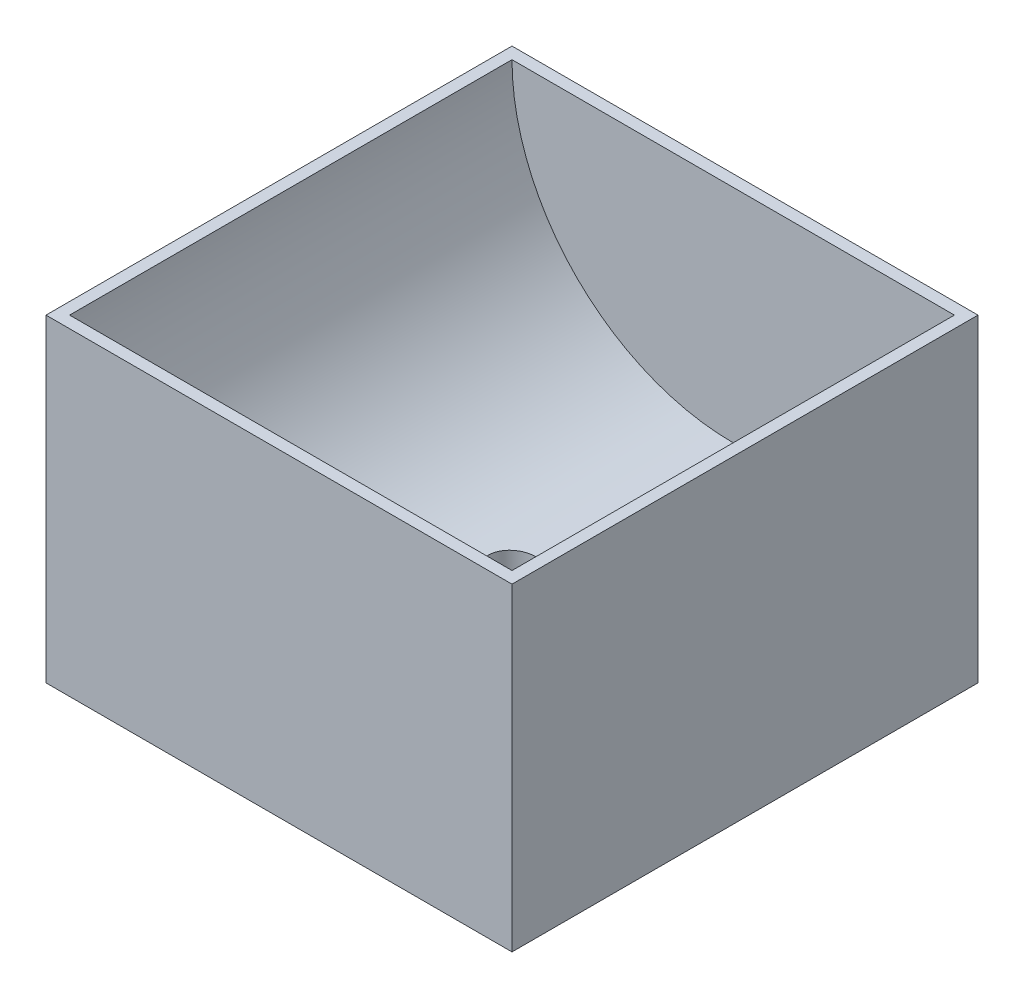
ISO-10303-21;
HEADER;
FILE_DESCRIPTION(('STEP AP214'),'2;1');
FILE_NAME('part.step','',(''),(''),'','','');
FILE_SCHEMA(('AUTOMOTIVE_DESIGN { 1 0 10303 214 1 1 1 1 }'));
ENDSEC;
DATA;
#1=APPLICATION_CONTEXT('core data for automotive mechanical design processes');
#2=APPLICATION_PROTOCOL_DEFINITION('international standard','automotive_design',2000,#1);
#3=PRODUCT_CONTEXT('',#1,'mechanical');
#4=PRODUCT('Part','Part','',(#3));
#5=PRODUCT_RELATED_PRODUCT_CATEGORY('part','',(#4));
#6=PRODUCT_DEFINITION_FORMATION('','',#4);
#7=PRODUCT_DEFINITION_CONTEXT('part definition',#1,'design');
#8=PRODUCT_DEFINITION('design','',#6,#7);
#9=PRODUCT_DEFINITION_SHAPE('','',#8);
#10=(LENGTH_UNIT() NAMED_UNIT(*) SI_UNIT(.MILLI.,.METRE.));
#11=(NAMED_UNIT(*) PLANE_ANGLE_UNIT() SI_UNIT($,.RADIAN.));
#12=(NAMED_UNIT(*) SI_UNIT($,.STERADIAN.) SOLID_ANGLE_UNIT());
#13=UNCERTAINTY_MEASURE_WITH_UNIT(LENGTH_MEASURE(1.E-05),#10,'distance_accuracy_value','');
#14=(GEOMETRIC_REPRESENTATION_CONTEXT(3) GLOBAL_UNCERTAINTY_ASSIGNED_CONTEXT((#13)) GLOBAL_UNIT_ASSIGNED_CONTEXT((#10,
#11,#12)) REPRESENTATION_CONTEXT('',''));
#15=CARTESIAN_POINT('',(0.,0.,0.));
#16=DIRECTION('',(0.,0.,1.));
#17=DIRECTION('',(1.,0.,0.));
#18=AXIS2_PLACEMENT_3D('',#15,#16,#17);
#19=CARTESIAN_POINT('',(-3.75277674973257,-54.,6.5));
#20=DIRECTION('',(0.866025403784439,0.,-0.5));
#21=DIRECTION('',(-0.5,0.,-0.866025403784439));
#22=AXIS2_PLACEMENT_3D('',#19,#20,#21);
#23=PLANE('',#22);
#24=DIRECTION('',(0.,1.,0.));
#25=VECTOR('',#24,1.);
#26=CARTESIAN_POINT('',(-3.75277674973257,-54.,6.5));
#27=LINE('',#26,#25);
#28=CARTESIAN_POINT('',(-3.75277674973257,-47.,6.5));
#29=VERTEX_POINT('',#28);
#30=CARTESIAN_POINT('',(-3.75277674973257,-40.5,6.5));
#31=VERTEX_POINT('',#30);
#32=EDGE_CURVE('E145',#29,#31,#27,.T.);
#33=ORIENTED_EDGE('',*,*,#32,.F.);
#34=DIRECTION('',(-0.5,0.,-0.866025403784439));
#35=VECTOR('',#34,1.);
#36=CARTESIAN_POINT('',(-3.75277674973257,-47.,6.5));
#37=LINE('',#36,#35);
#38=CARTESIAN_POINT('',(-7.50555349946513,-47.,0.));
#39=VERTEX_POINT('',#38);
#40=EDGE_CURVE('E55',#29,#39,#37,.T.);
#41=ORIENTED_EDGE('',*,*,#40,.T.);
#42=DIRECTION('',(0.,1.,0.));
#43=VECTOR('',#42,1.);
#44=CARTESIAN_POINT('',(-7.50555349946513,-54.,0.));
#45=LINE('',#44,#43);
#46=CARTESIAN_POINT('',(-7.50555349946513,-40.5,0.));
#47=VERTEX_POINT('',#46);
#48=EDGE_CURVE('E159',#39,#47,#45,.T.);
#49=ORIENTED_EDGE('',*,*,#48,.T.);
#50=DIRECTION('',(-0.5,0.,-0.866025403784438));
#51=VECTOR('',#50,1.);
#52=CARTESIAN_POINT('',(-3.75277674973257,-40.5,6.5));
#53=LINE('',#52,#51);
#54=EDGE_CURVE('E487',#31,#47,#53,.T.);
#55=ORIENTED_EDGE('',*,*,#54,.F.);
#56=EDGE_LOOP('',(#33,#41,#49,#55));
#57=FACE_BOUND('',#56,.T.);
#58=ADVANCED_FACE('F39',(#57),#23,.T.);
#59=CARTESIAN_POINT('',(-7.50555349946513,-54.,0.));
#60=DIRECTION('',(0.866025403784439,0.,0.5));
#61=DIRECTION('',(0.5,0.,-0.866025403784439));
#62=AXIS2_PLACEMENT_3D('',#59,#60,#61);
#63=PLANE('',#62);
#64=ORIENTED_EDGE('',*,*,#48,.F.);
#65=DIRECTION('',(0.5,0.,-0.866025403784439));
#66=VECTOR('',#65,1.);
#67=CARTESIAN_POINT('',(-7.50555349946513,-47.,0.));
#68=LINE('',#67,#66);
#69=CARTESIAN_POINT('',(-3.75277674973257,-47.,-6.5));
#70=VERTEX_POINT('',#69);
#71=EDGE_CURVE('E492',#39,#70,#68,.T.);
#72=ORIENTED_EDGE('',*,*,#71,.T.);
#73=DIRECTION('',(0.,1.,0.));
#74=VECTOR('',#73,1.);
#75=CARTESIAN_POINT('',(-3.75277674973257,-54.,-6.5));
#76=LINE('',#75,#74);
#77=CARTESIAN_POINT('',(-3.75277674973257,-40.5,-6.5));
#78=VERTEX_POINT('',#77);
#79=EDGE_CURVE('E156',#70,#78,#76,.T.);
#80=ORIENTED_EDGE('',*,*,#79,.T.);
#81=DIRECTION('',(0.5,0.,-0.866025403784439));
#82=VECTOR('',#81,1.);
#83=CARTESIAN_POINT('',(-7.50555349946513,-40.5,0.));
#84=LINE('',#83,#82);
#85=EDGE_CURVE('E483',#47,#78,#84,.T.);
#86=ORIENTED_EDGE('',*,*,#85,.F.);
#87=EDGE_LOOP('',(#64,#72,#80,#86));
#88=FACE_BOUND('',#87,.T.);
#89=ADVANCED_FACE('F278',(#88),#63,.T.);
#90=CARTESIAN_POINT('',(-3.75277674973257,-54.,-6.5));
#91=DIRECTION('',(0.,0.,1.));
#92=DIRECTION('',(1.,0.,0.));
#93=AXIS2_PLACEMENT_3D('',#90,#91,#92);
#94=PLANE('',#93);
#95=ORIENTED_EDGE('',*,*,#79,.F.);
#96=DIRECTION('',(1.,0.,0.));
#97=VECTOR('',#96,1.);
#98=CARTESIAN_POINT('',(-3.75277674973257,-47.,-6.5));
#99=LINE('',#98,#97);
#100=CARTESIAN_POINT('',(3.75277674973257,-47.,-6.5));
#101=VERTEX_POINT('',#100);
#102=EDGE_CURVE('E496',#70,#101,#99,.T.);
#103=ORIENTED_EDGE('',*,*,#102,.T.);
#104=DIRECTION('',(0.,1.,0.));
#105=VECTOR('',#104,1.);
#106=CARTESIAN_POINT('',(3.75277674973257,-54.,-6.5));
#107=LINE('',#106,#105);
#108=CARTESIAN_POINT('',(3.75277674973257,-40.5,-6.5));
#109=VERTEX_POINT('',#108);
#110=EDGE_CURVE('E149',#101,#109,#107,.T.);
#111=ORIENTED_EDGE('',*,*,#110,.T.);
#112=DIRECTION('',(1.,0.,0.));
#113=VECTOR('',#112,1.);
#114=CARTESIAN_POINT('',(-3.75277674973257,-40.5,-6.5));
#115=LINE('',#114,#113);
#116=EDGE_CURVE('E478',#78,#109,#115,.T.);
#117=ORIENTED_EDGE('',*,*,#116,.F.);
#118=EDGE_LOOP('',(#95,#103,#111,#117));
#119=FACE_BOUND('',#118,.T.);
#120=ADVANCED_FACE('F283',(#119),#94,.T.);
#121=CARTESIAN_POINT('',(3.75277674973257,-54.,-6.5));
#122=DIRECTION('',(-0.866025403784439,0.,0.5));
#123=DIRECTION('',(0.5,0.,0.866025403784439));
#124=AXIS2_PLACEMENT_3D('',#121,#122,#123);
#125=PLANE('',#124);
#126=ORIENTED_EDGE('',*,*,#110,.F.);
#127=DIRECTION('',(0.5,0.,0.866025403784439));
#128=VECTOR('',#127,1.);
#129=CARTESIAN_POINT('',(3.75277674973257,-47.,-6.5));
#130=LINE('',#129,#128);
#131=CARTESIAN_POINT('',(7.50555349946513,-47.,0.));
#132=VERTEX_POINT('',#131);
#133=EDGE_CURVE('E137',#101,#132,#130,.T.);
#134=ORIENTED_EDGE('',*,*,#133,.T.);
#135=DIRECTION('',(0.,1.,0.));
#136=VECTOR('',#135,1.);
#137=CARTESIAN_POINT('',(7.50555349946513,-54.,0.));
#138=LINE('',#137,#136);
#139=CARTESIAN_POINT('',(7.50555349946513,-40.5,0.));
#140=VERTEX_POINT('',#139);
#141=EDGE_CURVE('E135',#132,#140,#138,.T.);
#142=ORIENTED_EDGE('',*,*,#141,.T.);
#143=DIRECTION('',(0.5,0.,0.866025403784439));
#144=VECTOR('',#143,1.);
#145=CARTESIAN_POINT('',(3.75277674973257,-40.5,-6.5));
#146=LINE('',#145,#144);
#147=EDGE_CURVE('E473',#109,#140,#146,.T.);
#148=ORIENTED_EDGE('',*,*,#147,.F.);
#149=EDGE_LOOP('',(#126,#134,#142,#148));
#150=FACE_BOUND('',#149,.T.);
#151=ADVANCED_FACE('F289',(#150),#125,.T.);
#152=CARTESIAN_POINT('',(7.50555349946513,-54.,0.));
#153=DIRECTION('',(-0.866025403784439,0.,-0.5));
#154=DIRECTION('',(-0.5,0.,0.866025403784439));
#155=AXIS2_PLACEMENT_3D('',#152,#153,#154);
#156=PLANE('',#155);
#157=ORIENTED_EDGE('',*,*,#141,.F.);
#158=DIRECTION('',(-0.5,0.,0.866025403784439));
#159=VECTOR('',#158,1.);
#160=CARTESIAN_POINT('',(7.50555349946513,-47.,0.));
#161=LINE('',#160,#159);
#162=CARTESIAN_POINT('',(3.75277674973257,-47.,6.5));
#163=VERTEX_POINT('',#162);
#164=EDGE_CURVE('E129',#132,#163,#161,.T.);
#165=ORIENTED_EDGE('',*,*,#164,.T.);
#166=DIRECTION('',(0.,1.,0.));
#167=VECTOR('',#166,1.);
#168=CARTESIAN_POINT('',(3.75277674973257,-54.,6.5));
#169=LINE('',#168,#167);
#170=CARTESIAN_POINT('',(3.75277674973257,-40.5,6.5));
#171=VERTEX_POINT('',#170);
#172=EDGE_CURVE('E62',#163,#171,#169,.T.);
#173=ORIENTED_EDGE('',*,*,#172,.T.);
#174=DIRECTION('',(-0.5,0.,0.866025403784439));
#175=VECTOR('',#174,1.);
#176=CARTESIAN_POINT('',(7.50555349946513,-40.5,0.));
#177=LINE('',#176,#175);
#178=EDGE_CURVE('E463',#140,#171,#177,.T.);
#179=ORIENTED_EDGE('',*,*,#178,.F.);
#180=EDGE_LOOP('',(#157,#165,#173,#179));
#181=FACE_BOUND('',#180,.T.);
#182=ADVANCED_FACE('F134',(#181),#156,.T.);
#183=CARTESIAN_POINT('',(3.75277674973257,-54.,6.5));
#184=DIRECTION('',(0.,0.,-1.));
#185=DIRECTION('',(-1.,0.,0.));
#186=AXIS2_PLACEMENT_3D('',#183,#184,#185);
#187=PLANE('',#186);
#188=ORIENTED_EDGE('',*,*,#172,.F.);
#189=DIRECTION('',(-1.,0.,0.));
#190=VECTOR('',#189,1.);
#191=CARTESIAN_POINT('',(3.75277674973257,-47.,6.5));
#192=LINE('',#191,#190);
#193=EDGE_CURVE('E11',#163,#29,#192,.T.);
#194=ORIENTED_EDGE('',*,*,#193,.T.);
#195=ORIENTED_EDGE('',*,*,#32,.T.);
#196=DIRECTION('',(-1.,0.,0.));
#197=VECTOR('',#196,1.);
#198=CARTESIAN_POINT('',(3.75277674973257,-40.5,6.5));
#199=LINE('',#198,#197);
#200=EDGE_CURVE('E142',#171,#31,#199,.T.);
#201=ORIENTED_EDGE('',*,*,#200,.F.);
#202=EDGE_LOOP('',(#188,#194,#195,#201));
#203=FACE_BOUND('',#202,.T.);
#204=ADVANCED_FACE('F140',(#203),#187,.T.);
#205=CARTESIAN_POINT('',(-39.5,0.,37.5));
#206=DIRECTION('',(1.,0.,0.));
#207=DIRECTION('',(0.,1.,0.));
#208=AXIS2_PLACEMENT_3D('',#205,#206,#207);
#209=PLANE('',#208);
#210=DIRECTION('',(0.,0.,-1.));
#211=VECTOR('',#210,1.);
#212=CARTESIAN_POINT('',(-39.5,0.,37.5));
#213=LINE('',#212,#211);
#214=CARTESIAN_POINT('',(-39.5,0.,39.5));
#215=VERTEX_POINT('',#214);
#216=CARTESIAN_POINT('',(-39.5,0.,-39.5));
#217=VERTEX_POINT('',#216);
#218=EDGE_CURVE('E218',#215,#217,#213,.T.);
#219=ORIENTED_EDGE('',*,*,#218,.T.);
#220=DIRECTION('',(0.,1.,0.));
#221=VECTOR('',#220,1.);
#222=CARTESIAN_POINT('',(-39.5,0.,-39.5));
#223=LINE('',#222,#221);
#224=CARTESIAN_POINT('',(-39.5,-54.,-39.5));
#225=VERTEX_POINT('',#224);
#226=EDGE_CURVE('E186',#225,#217,#223,.T.);
#227=ORIENTED_EDGE('',*,*,#226,.F.);
#228=DIRECTION('',(0.,0.,-1.));
#229=VECTOR('',#228,1.);
#230=CARTESIAN_POINT('',(-39.5,-54.,-39.5));
#231=LINE('',#230,#229);
#232=CARTESIAN_POINT('',(-39.5,-54.,39.5));
#233=VERTEX_POINT('',#232);
#234=EDGE_CURVE('E162',#233,#225,#231,.T.);
#235=ORIENTED_EDGE('',*,*,#234,.F.);
#236=DIRECTION('',(0.,-1.,0.));
#237=VECTOR('',#236,1.);
#238=CARTESIAN_POINT('',(-39.5,0.,39.5));
#239=LINE('',#238,#237);
#240=EDGE_CURVE('E199',#215,#233,#239,.T.);
#241=ORIENTED_EDGE('',*,*,#240,.F.);
#242=EDGE_LOOP('',(#219,#227,#235,#241));
#243=FACE_BOUND('',#242,.T.);
#244=ADVANCED_FACE('F41',(#243),#209,.F.);
#245=CARTESIAN_POINT('',(-39.5,-40.5,37.5));
#246=DIRECTION('',(0.,1.,0.));
#247=DIRECTION('',(0.,0.,1.));
#248=AXIS2_PLACEMENT_3D('',#245,#246,#247);
#249=PLANE('',#248);
#250=ORIENTED_EDGE('',*,*,#178,.T.);
#251=ORIENTED_EDGE('',*,*,#200,.T.);
#252=ORIENTED_EDGE('',*,*,#54,.T.);
#253=ORIENTED_EDGE('',*,*,#85,.T.);
#254=ORIENTED_EDGE('',*,*,#116,.T.);
#255=ORIENTED_EDGE('',*,*,#147,.T.);
#256=EDGE_LOOP('',(#250,#251,#252,#253,#254,#255));
#257=FACE_BOUND('',#256,.T.);
#258=CARTESIAN_POINT('',(0.,-40.5,0.));
#259=DIRECTION('',(0.,-1.,0.));
#260=DIRECTION('',(0.,0.,-1.));
#261=AXIS2_PLACEMENT_3D('',#258,#259,#260);
#262=CIRCLE('',#261,4.05);
#263=CARTESIAN_POINT('',(0.,-40.5,-4.05));
#264=VERTEX_POINT('',#263);
#265=EDGE_CURVE('E178',#264,#264,#262,.T.);
#266=ORIENTED_EDGE('',*,*,#265,.F.);
#267=EDGE_LOOP('',(#266));
#268=FACE_BOUND('',#267,.T.);
#269=ADVANCED_FACE('F372',(#257,#268),#249,.F.);
#270=CARTESIAN_POINT('',(39.5,0.,37.5));
#271=DIRECTION('',(-1.,0.,0.));
#272=DIRECTION('',(0.,-1.,0.));
#273=AXIS2_PLACEMENT_3D('',#270,#271,#272);
#274=PLANE('',#273);
#275=DIRECTION('',(0.,1.,0.));
#276=VECTOR('',#275,1.);
#277=CARTESIAN_POINT('',(39.5,0.,39.5));
#278=LINE('',#277,#276);
#279=CARTESIAN_POINT('',(39.5,-54.,39.5));
#280=VERTEX_POINT('',#279);
#281=CARTESIAN_POINT('',(39.5,0.,39.5));
#282=VERTEX_POINT('',#281);
#283=EDGE_CURVE('E202',#280,#282,#278,.T.);
#284=ORIENTED_EDGE('',*,*,#283,.F.);
#285=DIRECTION('',(0.,0.,1.));
#286=VECTOR('',#285,1.);
#287=CARTESIAN_POINT('',(39.5,-54.,-39.5));
#288=LINE('',#287,#286);
#289=CARTESIAN_POINT('',(39.5,-54.,-39.5));
#290=VERTEX_POINT('',#289);
#291=EDGE_CURVE('E170',#290,#280,#288,.T.);
#292=ORIENTED_EDGE('',*,*,#291,.F.);
#293=DIRECTION('',(0.,-1.,0.));
#294=VECTOR('',#293,1.);
#295=CARTESIAN_POINT('',(39.5,0.,-39.5));
#296=LINE('',#295,#294);
#297=CARTESIAN_POINT('',(39.5,0.,-39.5));
#298=VERTEX_POINT('',#297);
#299=EDGE_CURVE('E183',#298,#290,#296,.T.);
#300=ORIENTED_EDGE('',*,*,#299,.F.);
#301=DIRECTION('',(0.,0.,-1.));
#302=VECTOR('',#301,1.);
#303=CARTESIAN_POINT('',(39.5,0.,37.5));
#304=LINE('',#303,#302);
#305=EDGE_CURVE('E48',#282,#298,#304,.T.);
#306=ORIENTED_EDGE('',*,*,#305,.F.);
#307=EDGE_LOOP('',(#284,#292,#300,#306));
#308=FACE_BOUND('',#307,.T.);
#309=ADVANCED_FACE('F273',(#308),#274,.F.);
#310=CARTESIAN_POINT('',(0.,0.,37.5));
#311=DIRECTION('',(0.,0.,-1.));
#312=DIRECTION('',(-1.,0.,0.));
#313=AXIS2_PLACEMENT_3D('',#310,#311,#312);
#314=CYLINDRICAL_SURFACE('',#313,37.5);
#315=CARTESIAN_POINT('',(0.,-37.5,-4.05));
#316=CARTESIAN_POINT('',(0.226781742461132,-37.4999972052335,-4.04999023039859));
#317=CARTESIAN_POINT('',(0.453710992489959,-37.4979209812932,-4.03088770691414));
#318=CARTESIAN_POINT('',(0.901271227519602,-37.4898381763892,-3.95497626381555));
#319=CARTESIAN_POINT('',(1.12189510975365,-37.4838273322748,-3.89812644414317));
#320=CARTESIAN_POINT('',(1.55029920668016,-37.4685534007037,-3.7484007139441));
#321=CARTESIAN_POINT('',(1.75808734899971,-37.4592923447499,-3.65554730320382));
#322=CARTESIAN_POINT('',(2.15508632191224,-37.4385518952597,-3.43649554911533));
#323=CARTESIAN_POINT('',(2.34430068615882,-37.427072924919,-3.310303565346));
#324=CARTESIAN_POINT('',(2.69961260455621,-37.4031277934599,-3.02759351481716));
#325=CARTESIAN_POINT('',(2.86562183013626,-37.390658129302,-2.87096472214567));
#326=CARTESIAN_POINT('',(3.16905139635476,-37.3661657673042,-2.53206397014592));
#327=CARTESIAN_POINT('',(3.30647037640984,-37.3541430907584,-2.34979079111658));
#328=CARTESIAN_POINT('',(3.54913683663403,-37.3318706609017,-1.96421547281737));
#329=CARTESIAN_POINT('',(3.65430346162434,-37.3216253909175,-1.76086216516045));
#330=CARTESIAN_POINT('',(3.82896363428333,-37.3041122177281,-1.33925292488339));
#331=CARTESIAN_POINT('',(3.8984582015873,-37.2968442294228,-1.12099741842357));
#332=CARTESIAN_POINT('',(3.99953752008237,-37.2861408503327,-0.676685640728697));
#333=CARTESIAN_POINT('',(4.03126968864491,-37.282690559698,-0.450663271435225));
#334=CARTESIAN_POINT('',(4.05637928525302,-37.2799672133396,0.00352338819449211));
#335=CARTESIAN_POINT('',(4.04975787898169,-37.2806940306606,0.231687613222727));
#336=CARTESIAN_POINT('',(3.99846963616301,-37.2862291593877,0.68266175556731));
#337=CARTESIAN_POINT('',(3.95396417745422,-37.2910201579666,0.905490268472334));
#338=CARTESIAN_POINT('',(3.82842248113578,-37.3041168013107,1.34049679655627));
#339=CARTESIAN_POINT('',(3.74738567641308,-37.3124225006379,1.55267464633733));
#340=CARTESIAN_POINT('',(3.55090488420791,-37.3316325521982,1.96086418507029));
#341=CARTESIAN_POINT('',(3.43538973535784,-37.3425422695582,2.15684135795046));
#342=CARTESIAN_POINT('',(3.17328236867837,-37.3657267042365,2.52668861650129));
#343=CARTESIAN_POINT('',(3.02668908930458,-37.3780014681742,2.70055794670358));
#344=CARTESIAN_POINT('',(2.70568743534317,-37.402610052654,3.02219145524921));
#345=CARTESIAN_POINT('',(2.53113977001068,-37.4149438519567,3.16981665375548));
#346=CARTESIAN_POINT('',(2.15966656946273,-37.438221317648,3.43369270760379));
#347=CARTESIAN_POINT('',(1.96274100237949,-37.4491649820568,3.54994351826561));
#348=CARTESIAN_POINT('',(1.55200247595709,-37.4684336064043,3.74776696399377));
#349=CARTESIAN_POINT('',(1.3381858568844,-37.4767579968752,3.82933205923954));
#350=CARTESIAN_POINT('',(0.899782257790002,-37.4898445587101,3.95536438429587));
#351=CARTESIAN_POINT('',(0.675195653926506,-37.4946068543894,3.99983290876449));
#352=CARTESIAN_POINT('',(0.222830280369027,-37.5000166249185,4.05023235256062));
#353=CARTESIAN_POINT('',(-0.00492689859086788,-37.5006845662119,4.05635495494172));
#354=CARTESIAN_POINT('',(-0.458224077365138,-37.4978853613115,4.03039291880287));
#355=CARTESIAN_POINT('',(-0.683764112157913,-37.4944182804591,3.99830888402193));
#356=CARTESIAN_POINT('',(-1.12566784160614,-37.4837515834479,3.89700341462775));
#357=CARTESIAN_POINT('',(-1.34205246087235,-37.4765610382882,3.82787221905001));
#358=CARTESIAN_POINT('',(-1.76015465587528,-37.4592535700669,3.65452786414384));
#359=CARTESIAN_POINT('',(-1.96187185131664,-37.4491365711623,3.55031379558463));
#360=CARTESIAN_POINT('',(-2.34577672942,-37.4270556709393,3.30929001821664));
#361=CARTESIAN_POINT('',(-2.52788529446606,-37.415084730267,3.1723549456262));
#362=CARTESIAN_POINT('',(-2.86660144159585,-37.3906604560875,2.86995527933073));
#363=CARTESIAN_POINT('',(-3.0232082745049,-37.3782071084218,2.7044898477717));
#364=CARTESIAN_POINT('',(-3.30714534176142,-37.3541595338381,2.34888763516678));
#365=CARTESIAN_POINT('',(-3.43434939408423,-37.3425691493267,2.15864980495412));
#366=CARTESIAN_POINT('',(-3.65500135274281,-37.3216197637351,1.75939894264221));
#367=CARTESIAN_POINT('',(-3.7484497862912,-37.3122607278052,1.5503862038428));
#368=CARTESIAN_POINT('',(-3.89872865399257,-37.2968584317319,1.11994376131258));
#369=CARTESIAN_POINT('',(-3.95563299649227,-37.2908084828489,0.898540110296211));
#370=CARTESIAN_POINT('',(-4.0314476835964,-37.2826891038178,0.449251494522069));
#371=CARTESIAN_POINT('',(-4.05035931633022,-37.2806195387164,0.221366749769171));
#372=CARTESIAN_POINT('',(-4.04963218089895,-37.2806984336908,-0.233160799103167));
#373=CARTESIAN_POINT('',(-4.03019162449235,-37.2828252062659,-0.459803949987028));
#374=CARTESIAN_POINT('',(-3.95372877926655,-37.2910107891274,-0.906583618182499));
#375=CARTESIAN_POINT('',(-3.89670645808758,-37.2970696027996,-1.1267201298914));
#376=CARTESIAN_POINT('',(-3.7467556600517,-37.3124303745127,-1.55422874120948));
#377=CARTESIAN_POINT('',(-3.65383413368626,-37.3217317047318,-1.76160330267185));
#378=CARTESIAN_POINT('',(-3.43474262780274,-37.3425306941893,-2.15784557395418));
#379=CARTESIAN_POINT('',(-3.30857265408356,-37.3540283530447,-2.34671328700194));
#380=CARTESIAN_POINT('',(-3.02582347102251,-37.377995744153,-2.70159603456152));
#381=CARTESIAN_POINT('',(-2.86909642954218,-37.3904700181576,-2.86749298318042));
#382=CARTESIAN_POINT('',(-2.52998134197932,-37.4149439516112,-3.17071529549674));
#383=CARTESIAN_POINT('',(-2.34758718906797,-37.4269434972379,-3.30803384036803));
#384=CARTESIAN_POINT('',(-1.96172859436409,-37.4491528061149,-3.55052271470049));
#385=CARTESIAN_POINT('',(-1.7582048214763,-37.4593573002639,-3.65559905255383));
#386=CARTESIAN_POINT('',(-1.336416566336,-37.4767709616603,-3.82994158622728));
#387=CARTESIAN_POINT('',(-1.11816883575665,-37.483983468287,-3.89924772664705));
#388=CARTESIAN_POINT('',(-0.748929827447147,-37.4928098647816,-3.98300427419485));
#389=CARTESIAN_POINT('',(-0.600290139215499,-37.4954934272971,-4.00809282472926));
#390=CARTESIAN_POINT('',(-0.301121975848887,-37.4990894183971,-4.04159388959811));
#391=CARTESIAN_POINT('',(-0.150593510178883,-37.5000018558535,-4.05000648746479));
#392=CARTESIAN_POINT('',(0.,-37.5,-4.05));
#393=B_SPLINE_CURVE_WITH_KNOTS('',3,(#315,#316,#317,#318,#319,#320,#321,#322,#323,#324,#325,
#326,#327,#328,#329,#330,#331,#332,#333,#334,#335,#336,#337,#338,#339,#340,#341,#342,#343,#344,
#345,#346,#347,#348,#349,#350,#351,#352,#353,#354,#355,#356,#357,#358,#359,#360,#361,#362,#363,
#364,#365,#366,#367,#368,#369,#370,#371,#372,#373,#374,#375,#376,#377,#378,#379,#380,#381,#382,
#383,#384,#385,#386,#387,#388,#389,#390,#391,#392),.UNSPECIFIED.,.T.,.F.,(4,2,2,2,2,2,2,2,2,2,2,
2,2,2,2,2,2,2,2,2,2,2,2,2,2,2,2,2,2,2,2,2,2,2,2,2,2,2,4),(0.,0.679795270285116,1.36032831889253,
2.04043676446539,2.7204155678907,3.4029160067253,4.08544891770001,4.76967917790006,
5.45388987925701,6.13542069449478,6.81693079602389,7.49555225743288,8.17418425413225,
8.85422671035963,9.53429239873064,10.2178586422115,10.9014258591531,11.5851415909172,
12.26883346023,12.9491049544025,13.6293656991079,14.3079769543938,14.9866057983686,
15.6678775770883,16.3491693661951,17.0333327745749,17.7174854968768,18.4002501650893,
19.0829916840165,19.7622139018177,20.4414367044636,21.1205280677554,21.7996193126059,
22.4820813261361,23.164705989341,23.8493021192059,24.5331320970338,24.9845496919777,
25.4359650257001),.UNSPECIFIED.);
#394=CARTESIAN_POINT('',(0.,-37.5,-4.05));
#395=VERTEX_POINT('',#394);
#396=EDGE_CURVE('E182',#395,#395,#393,.T.);
#397=ORIENTED_EDGE('',*,*,#396,.T.);
#398=EDGE_LOOP('',(#397));
#399=FACE_BOUND('',#398,.T.);
#400=CARTESIAN_POINT('',(0.,0.,-37.5));
#401=DIRECTION('',(0.,0.,-1.));
#402=DIRECTION('',(1.,0.,0.));
#403=AXIS2_PLACEMENT_3D('',#400,#401,#402);
#404=CIRCLE('',#403,37.5);
#405=CARTESIAN_POINT('',(37.5,0.,-37.5));
#406=VERTEX_POINT('',#405);
#407=CARTESIAN_POINT('',(-37.5,0.,-37.5));
#408=VERTEX_POINT('',#407);
#409=EDGE_CURVE('E210',#406,#408,#404,.T.);
#410=ORIENTED_EDGE('',*,*,#409,.T.);
#411=DIRECTION('',(0.,0.,-1.));
#412=VECTOR('',#411,1.);
#413=CARTESIAN_POINT('',(-37.5,0.,37.5));
#414=LINE('',#413,#412);
#415=CARTESIAN_POINT('',(-37.5,0.,37.5));
#416=VERTEX_POINT('',#415);
#417=EDGE_CURVE('E224',#416,#408,#414,.T.);
#418=ORIENTED_EDGE('',*,*,#417,.F.);
#419=CARTESIAN_POINT('',(0.,0.,37.5));
#420=DIRECTION('',(0.,0.,-1.));
#421=DIRECTION('',(1.,0.,0.));
#422=AXIS2_PLACEMENT_3D('',#419,#420,#421);
#423=CIRCLE('',#422,37.5);
#424=CARTESIAN_POINT('',(37.5,0.,37.5));
#425=VERTEX_POINT('',#424);
#426=EDGE_CURVE('E214',#425,#416,#423,.T.);
#427=ORIENTED_EDGE('',*,*,#426,.F.);
#428=DIRECTION('',(0.,0.,-1.));
#429=VECTOR('',#428,1.);
#430=CARTESIAN_POINT('',(37.5,0.,37.5));
#431=LINE('',#430,#429);
#432=EDGE_CURVE('E228',#425,#406,#431,.T.);
#433=ORIENTED_EDGE('',*,*,#432,.T.);
#434=EDGE_LOOP('',(#410,#418,#427,#433));
#435=FACE_BOUND('',#434,.T.);
#436=ADVANCED_FACE('F240',(#399,#435),#314,.F.);
#437=CARTESIAN_POINT('',(-39.5,0.,37.5));
#438=DIRECTION('',(0.,-1.,0.));
#439=DIRECTION('',(0.,0.,-1.));
#440=AXIS2_PLACEMENT_3D('',#437,#438,#439);
#441=PLANE('',#440);
#442=DIRECTION('',(1.,0.,0.));
#443=VECTOR('',#442,1.);
#444=CARTESIAN_POINT('',(39.5,0.,-39.5));
#445=LINE('',#444,#443);
#446=EDGE_CURVE('E191',#217,#298,#445,.T.);
#447=ORIENTED_EDGE('',*,*,#446,.F.);
#448=ORIENTED_EDGE('',*,*,#218,.F.);
#449=DIRECTION('',(-1.,0.,0.));
#450=VECTOR('',#449,1.);
#451=CARTESIAN_POINT('',(-39.5,0.,39.5));
#452=LINE('',#451,#450);
#453=EDGE_CURVE('E206',#282,#215,#452,.T.);
#454=ORIENTED_EDGE('',*,*,#453,.F.);
#455=ORIENTED_EDGE('',*,*,#305,.T.);
#456=EDGE_LOOP('',(#447,#448,#454,#455));
#457=FACE_BOUND('',#456,.T.);
#458=ORIENTED_EDGE('',*,*,#417,.T.);
#459=DIRECTION('',(1.,0.,0.));
#460=VECTOR('',#459,1.);
#461=CARTESIAN_POINT('',(39.5,0.,-37.5));
#462=LINE('',#461,#460);
#463=EDGE_CURVE('E187',#408,#406,#462,.T.);
#464=ORIENTED_EDGE('',*,*,#463,.T.);
#465=ORIENTED_EDGE('',*,*,#432,.F.);
#466=DIRECTION('',(-1.,0.,0.));
#467=VECTOR('',#466,1.);
#468=CARTESIAN_POINT('',(-39.5,0.,37.5));
#469=LINE('',#468,#467);
#470=EDGE_CURVE('E195',#425,#416,#469,.T.);
#471=ORIENTED_EDGE('',*,*,#470,.T.);
#472=EDGE_LOOP('',(#458,#464,#465,#471));
#473=FACE_BOUND('',#472,.T.);
#474=ADVANCED_FACE('F266',(#457,#473),#441,.F.);
#475=CARTESIAN_POINT('',(0.,0.,37.5));
#476=DIRECTION('',(0.,0.,1.));
#477=DIRECTION('',(1.,0.,0.));
#478=AXIS2_PLACEMENT_3D('',#475,#476,#477);
#479=PLANE('',#478);
#480=ORIENTED_EDGE('',*,*,#470,.F.);
#481=ORIENTED_EDGE('',*,*,#426,.T.);
#482=EDGE_LOOP('',(#480,#481));
#483=FACE_BOUND('',#482,.T.);
#484=ADVANCED_FACE('F263',(#483),#479,.F.);
#485=CARTESIAN_POINT('',(0.,0.,39.5));
#486=DIRECTION('',(0.,0.,1.));
#487=DIRECTION('',(1.,0.,0.));
#488=AXIS2_PLACEMENT_3D('',#485,#486,#487);
#489=PLANE('',#488);
#490=ORIENTED_EDGE('',*,*,#240,.T.);
#491=DIRECTION('',(-1.,0.,0.));
#492=VECTOR('',#491,1.);
#493=CARTESIAN_POINT('',(-39.5,-54.,39.5));
#494=LINE('',#493,#492);
#495=EDGE_CURVE('E174',#280,#233,#494,.T.);
#496=ORIENTED_EDGE('',*,*,#495,.F.);
#497=ORIENTED_EDGE('',*,*,#283,.T.);
#498=ORIENTED_EDGE('',*,*,#453,.T.);
#499=EDGE_LOOP('',(#490,#496,#497,#498));
#500=FACE_BOUND('',#499,.T.);
#501=ADVANCED_FACE('F259',(#500),#489,.T.);
#502=CARTESIAN_POINT('',(0.,0.,-37.5));
#503=DIRECTION('',(0.,0.,-1.));
#504=DIRECTION('',(-1.,0.,0.));
#505=AXIS2_PLACEMENT_3D('',#502,#503,#504);
#506=PLANE('',#505);
#507=ORIENTED_EDGE('',*,*,#409,.F.);
#508=ORIENTED_EDGE('',*,*,#463,.F.);
#509=EDGE_LOOP('',(#507,#508));
#510=FACE_BOUND('',#509,.T.);
#511=ADVANCED_FACE('F255',(#510),#506,.F.);
#512=CARTESIAN_POINT('',(0.,0.,-39.5));
#513=DIRECTION('',(0.,0.,-1.));
#514=DIRECTION('',(-1.,0.,0.));
#515=AXIS2_PLACEMENT_3D('',#512,#513,#514);
#516=PLANE('',#515);
#517=ORIENTED_EDGE('',*,*,#299,.T.);
#518=DIRECTION('',(1.,0.,0.));
#519=VECTOR('',#518,1.);
#520=CARTESIAN_POINT('',(-39.5,-54.,-39.5));
#521=LINE('',#520,#519);
#522=EDGE_CURVE('E166',#225,#290,#521,.T.);
#523=ORIENTED_EDGE('',*,*,#522,.F.);
#524=ORIENTED_EDGE('',*,*,#226,.T.);
#525=ORIENTED_EDGE('',*,*,#446,.T.);
#526=EDGE_LOOP('',(#517,#523,#524,#525));
#527=FACE_BOUND('',#526,.T.);
#528=ADVANCED_FACE('F250',(#527),#516,.T.);
#529=CARTESIAN_POINT('',(0.,0.,0.));
#530=DIRECTION('',(0.,-1.,0.));
#531=DIRECTION('',(0.,0.,-1.));
#532=AXIS2_PLACEMENT_3D('',#529,#530,#531);
#533=CYLINDRICAL_SURFACE('',#532,4.05);
#534=ORIENTED_EDGE('',*,*,#265,.T.);
#535=EDGE_LOOP('',(#534));
#536=FACE_BOUND('',#535,.T.);
#537=ORIENTED_EDGE('',*,*,#396,.F.);
#538=EDGE_LOOP('',(#537));
#539=FACE_BOUND('',#538,.T.);
#540=ADVANCED_FACE('F244',(#536,#539),#533,.F.);
#541=CARTESIAN_POINT('',(0.,-54.,0.));
#542=DIRECTION('',(0.,1.,0.));
#543=DIRECTION('',(0.,0.,1.));
#544=AXIS2_PLACEMENT_3D('',#541,#542,#543);
#545=PLANE('',#544);
#546=CARTESIAN_POINT('',(0.,-54.,0.));
#547=DIRECTION('',(0.,-1.,0.));
#548=DIRECTION('',(0.,0.,-1.));
#549=AXIS2_PLACEMENT_3D('',#546,#547,#548);
#550=CIRCLE('',#549,8.);
#551=CARTESIAN_POINT('',(0.,-54.,-8.));
#552=VERTEX_POINT('',#551);
#553=EDGE_CURVE('E502',#552,#552,#550,.T.);
#554=ORIENTED_EDGE('',*,*,#553,.F.);
#555=EDGE_LOOP('',(#554));
#556=FACE_BOUND('',#555,.T.);
#557=ORIENTED_EDGE('',*,*,#234,.T.);
#558=ORIENTED_EDGE('',*,*,#522,.T.);
#559=ORIENTED_EDGE('',*,*,#291,.T.);
#560=ORIENTED_EDGE('',*,*,#495,.T.);
#561=EDGE_LOOP('',(#557,#558,#559,#560));
#562=FACE_BOUND('',#561,.T.);
#563=ADVANCED_FACE('F249',(#556,#562),#545,.F.);
#564=CARTESIAN_POINT('',(0.,-47.,0.));
#565=DIRECTION('',(0.,-1.,0.));
#566=DIRECTION('',(0.,0.,-1.));
#567=AXIS2_PLACEMENT_3D('',#564,#565,#566);
#568=CYLINDRICAL_SURFACE('',#567,8.);
#569=CARTESIAN_POINT('',(0.,-47.,0.));
#570=DIRECTION('',(0.,-1.,0.));
#571=DIRECTION('',(0.,0.,-1.));
#572=AXIS2_PLACEMENT_3D('',#569,#570,#571);
#573=CIRCLE('',#572,8.);
#574=CARTESIAN_POINT('',(0.,-47.,-8.));
#575=VERTEX_POINT('',#574);
#576=EDGE_CURVE('E138',#575,#575,#573,.T.);
#577=ORIENTED_EDGE('',*,*,#576,.F.);
#578=EDGE_LOOP('',(#577));
#579=FACE_BOUND('',#578,.T.);
#580=ORIENTED_EDGE('',*,*,#553,.T.);
#581=EDGE_LOOP('',(#580));
#582=FACE_BOUND('',#581,.T.);
#583=ADVANCED_FACE('F298',(#579,#582),#568,.F.);
#584=CARTESIAN_POINT('',(0.,-47.,0.));
#585=DIRECTION('',(0.,-1.,0.));
#586=DIRECTION('',(0.,0.,-1.));
#587=AXIS2_PLACEMENT_3D('',#584,#585,#586);
#588=PLANE('',#587);
#589=ORIENTED_EDGE('',*,*,#193,.F.);
#590=ORIENTED_EDGE('',*,*,#164,.F.);
#591=ORIENTED_EDGE('',*,*,#133,.F.);
#592=ORIENTED_EDGE('',*,*,#102,.F.);
#593=ORIENTED_EDGE('',*,*,#71,.F.);
#594=ORIENTED_EDGE('',*,*,#40,.F.);
#595=EDGE_LOOP('',(#589,#590,#591,#592,#593,#594));
#596=FACE_BOUND('',#595,.T.);
#597=ORIENTED_EDGE('',*,*,#576,.T.);
#598=EDGE_LOOP('',(#597));
#599=FACE_BOUND('',#598,.T.);
#600=ADVANCED_FACE('F127',(#596,#599),#588,.T.);
#601=CLOSED_SHELL('',(#58,#89,#120,#151,#182,#204,#244,#269,#309,#436,#474,#484,#501,#511,#528,
#540,#563,#583,#600));
#602=MANIFOLD_SOLID_BREP('B2',#601);
#603=ADVANCED_BREP_SHAPE_REPRESENTATION('',(#18,#602),#14);
#604=SHAPE_DEFINITION_REPRESENTATION(#9,#603);
ENDSEC;
END-ISO-10303-21;
